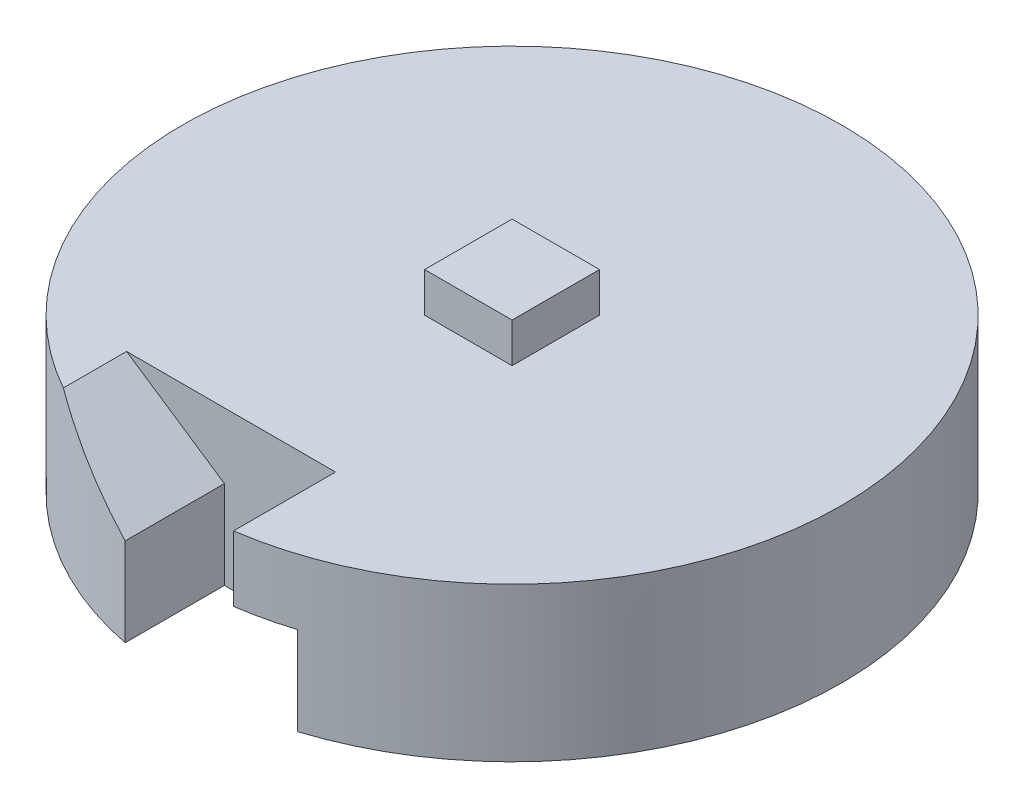
ISO-10303-21;
HEADER;
FILE_DESCRIPTION(('STEP AP214'),'2;1');
FILE_NAME('part.step','',(''),(''),'','','');
FILE_SCHEMA(('AUTOMOTIVE_DESIGN { 1 0 10303 214 1 1 1 1 }'));
ENDSEC;
DATA;
#1=APPLICATION_CONTEXT('core data for automotive mechanical design processes');
#2=APPLICATION_PROTOCOL_DEFINITION('international standard','automotive_design',2000,#1);
#3=PRODUCT_CONTEXT('',#1,'mechanical');
#4=PRODUCT('Part','Part','',(#3));
#5=PRODUCT_RELATED_PRODUCT_CATEGORY('part','',(#4));
#6=PRODUCT_DEFINITION_FORMATION('','',#4);
#7=PRODUCT_DEFINITION_CONTEXT('part definition',#1,'design');
#8=PRODUCT_DEFINITION('design','',#6,#7);
#9=PRODUCT_DEFINITION_SHAPE('','',#8);
#10=(LENGTH_UNIT() NAMED_UNIT(*) SI_UNIT(.MILLI.,.METRE.));
#11=(NAMED_UNIT(*) PLANE_ANGLE_UNIT() SI_UNIT($,.RADIAN.));
#12=(NAMED_UNIT(*) SI_UNIT($,.STERADIAN.) SOLID_ANGLE_UNIT());
#13=UNCERTAINTY_MEASURE_WITH_UNIT(LENGTH_MEASURE(1.E-05),#10,'distance_accuracy_value','');
#14=(GEOMETRIC_REPRESENTATION_CONTEXT(3) GLOBAL_UNCERTAINTY_ASSIGNED_CONTEXT((#13)) GLOBAL_UNIT_ASSIGNED_CONTEXT((#10,
#11,#12)) REPRESENTATION_CONTEXT('',''));
#15=CARTESIAN_POINT('',(0.,0.,0.));
#16=DIRECTION('',(0.,0.,1.));
#17=DIRECTION('',(1.,0.,0.));
#18=AXIS2_PLACEMENT_3D('',#15,#16,#17);
#19=CARTESIAN_POINT('',(0.,17.5,0.));
#20=DIRECTION('',(0.,1.,0.));
#21=DIRECTION('',(0.,0.,1.));
#22=AXIS2_PLACEMENT_3D('',#19,#20,#21);
#23=PLANE('',#22);
#24=DIRECTION('',(0.,0.,-1.));
#25=VECTOR('',#24,1.);
#26=CARTESIAN_POINT('',(5.40916797594821,17.5,0.));
#27=LINE('',#26,#25);
#28=CARTESIAN_POINT('',(5.40916797594821,17.5,37.1078280394848));
#29=VERTEX_POINT('',#28);
#30=CARTESIAN_POINT('',(5.40916797594821,17.5,25.5));
#31=VERTEX_POINT('',#30);
#32=EDGE_CURVE('E47',#29,#31,#27,.T.);
#33=ORIENTED_EDGE('',*,*,#32,.F.);
#34=CARTESIAN_POINT('',(0.,17.5,0.));
#35=DIRECTION('',(0.,1.,0.));
#36=DIRECTION('',(0.,0.,1.));
#37=AXIS2_PLACEMENT_3D('',#34,#35,#36);
#38=CIRCLE('',#37,37.5);
#39=CARTESIAN_POINT('',(-18.3618136354973,17.5,32.6969998626061));
#40=VERTEX_POINT('',#39);
#41=EDGE_CURVE('E196',#29,#40,#38,.T.);
#42=ORIENTED_EDGE('',*,*,#41,.T.);
#43=DIRECTION('',(0.,0.,1.));
#44=VECTOR('',#43,1.);
#45=CARTESIAN_POINT('',(-18.3618136354973,17.5,0.));
#46=LINE('',#45,#44);
#47=CARTESIAN_POINT('',(-18.3618136354973,17.5,25.5));
#48=VERTEX_POINT('',#47);
#49=EDGE_CURVE('E209',#48,#40,#46,.T.);
#50=ORIENTED_EDGE('',*,*,#49,.F.);
#51=DIRECTION('',(1.,0.,0.));
#52=VECTOR('',#51,1.);
#53=CARTESIAN_POINT('',(0.,17.5,25.5));
#54=LINE('',#53,#52);
#55=EDGE_CURVE('E175',#48,#31,#54,.T.);
#56=ORIENTED_EDGE('',*,*,#55,.T.);
#57=EDGE_LOOP('',(#33,#42,#50,#56));
#58=FACE_BOUND('',#57,.T.);
#59=DIRECTION('',(1.,0.,0.));
#60=VECTOR('',#59,1.);
#61=CARTESIAN_POINT('',(0.,17.5,-4.975));
#62=LINE('',#61,#60);
#63=CARTESIAN_POINT('',(-4.975,17.5,-4.975));
#64=VERTEX_POINT('',#63);
#65=CARTESIAN_POINT('',(4.975,17.5,-4.975));
#66=VERTEX_POINT('',#65);
#67=EDGE_CURVE('E157',#64,#66,#62,.T.);
#68=ORIENTED_EDGE('',*,*,#67,.T.);
#69=DIRECTION('',(0.,0.,1.));
#70=VECTOR('',#69,1.);
#71=CARTESIAN_POINT('',(4.975,17.5,0.));
#72=LINE('',#71,#70);
#73=CARTESIAN_POINT('',(4.975,17.5,4.975));
#74=VERTEX_POINT('',#73);
#75=EDGE_CURVE('E146',#66,#74,#72,.T.);
#76=ORIENTED_EDGE('',*,*,#75,.T.);
#77=DIRECTION('',(-1.,0.,0.));
#78=VECTOR('',#77,1.);
#79=CARTESIAN_POINT('',(0.,17.5,4.975));
#80=LINE('',#79,#78);
#81=CARTESIAN_POINT('',(-4.975,17.5,4.975));
#82=VERTEX_POINT('',#81);
#83=EDGE_CURVE('E147',#74,#82,#80,.T.);
#84=ORIENTED_EDGE('',*,*,#83,.T.);
#85=DIRECTION('',(0.,0.,-1.));
#86=VECTOR('',#85,1.);
#87=CARTESIAN_POINT('',(-4.975,17.5,0.));
#88=LINE('',#87,#86);
#89=EDGE_CURVE('E150',#82,#64,#88,.T.);
#90=ORIENTED_EDGE('',*,*,#89,.T.);
#91=EDGE_LOOP('',(#68,#76,#84,#90));
#92=FACE_BOUND('',#91,.T.);
#93=ADVANCED_FACE('F39',(#58,#92),#23,.T.);
#94=CARTESIAN_POINT('',(0.,17.5,0.));
#95=DIRECTION('',(0.,-1.,0.));
#96=DIRECTION('',(0.,0.,-1.));
#97=AXIS2_PLACEMENT_3D('',#94,#95,#96);
#98=CYLINDRICAL_SURFACE('',#97,37.5);
#99=ORIENTED_EDGE('',*,*,#41,.F.);
#100=DIRECTION('',(0.,-1.,0.));
#101=VECTOR('',#100,1.);
#102=CARTESIAN_POINT('',(5.40916797594821,17.5,37.1078280394848));
#103=LINE('',#102,#101);
#104=CARTESIAN_POINT('',(5.40916797594821,10.0586939101936,37.1078280394848));
#105=VERTEX_POINT('',#104);
#106=EDGE_CURVE('E192',#29,#105,#103,.T.);
#107=ORIENTED_EDGE('',*,*,#106,.T.);
#108=CARTESIAN_POINT('',(0.,10.0586939101936,0.));
#109=DIRECTION('',(0.,1.,0.));
#110=DIRECTION('',(0.,0.,1.));
#111=AXIS2_PLACEMENT_3D('',#108,#109,#110);
#112=CIRCLE('',#111,37.5);
#113=CARTESIAN_POINT('',(11.3377548552186,10.0586939101936,35.7450040543146));
#114=VERTEX_POINT('',#113);
#115=EDGE_CURVE('E11',#105,#114,#112,.T.);
#116=ORIENTED_EDGE('',*,*,#115,.T.);
#117=DIRECTION('',(0.,-1.,0.));
#118=VECTOR('',#117,1.);
#119=CARTESIAN_POINT('',(11.3377548552186,17.5,35.7450040543146));
#120=LINE('',#119,#118);
#121=CARTESIAN_POINT('',(11.3377548552186,0.,35.7450040543146));
#122=VERTEX_POINT('',#121);
#123=EDGE_CURVE('E186',#114,#122,#120,.T.);
#124=ORIENTED_EDGE('',*,*,#123,.T.);
#125=CARTESIAN_POINT('',(0.,0.,0.));
#126=DIRECTION('',(0.,1.,0.));
#127=DIRECTION('',(0.,0.,1.));
#128=AXIS2_PLACEMENT_3D('',#125,#126,#127);
#129=CIRCLE('',#128,37.5);
#130=CARTESIAN_POINT('',(-7.23202995206033,0.,36.7960288994954));
#131=VERTEX_POINT('',#130);
#132=EDGE_CURVE('E195',#122,#131,#129,.T.);
#133=ORIENTED_EDGE('',*,*,#132,.T.);
#134=DIRECTION('',(0.,-1.,0.));
#135=VECTOR('',#134,1.);
#136=CARTESIAN_POINT('',(-7.23202995206033,17.5,36.7960288994954));
#137=LINE('',#136,#135);
#138=CARTESIAN_POINT('',(-7.23202995206033,10.0401319165543,36.7960288994954));
#139=VERTEX_POINT('',#138);
#140=EDGE_CURVE('E183',#131,#139,#137,.F.);
#141=ORIENTED_EDGE('',*,*,#140,.T.);
#142=CARTESIAN_POINT('',(0.,5.19277899825944,0.));
#143=DIRECTION('',(-0.556765929579434,-0.830669428629433,0.));
#144=DIRECTION('',(0.830669428629433,-0.556765929579434,0.));
#145=AXIS2_PLACEMENT_3D('',#142,#143,#144);
#146=ELLIPSE('',#145,45.1443121746677,37.5);
#147=EDGE_CURVE('E189',#139,#40,#146,.T.);
#148=ORIENTED_EDGE('',*,*,#147,.T.);
#149=EDGE_LOOP('',(#99,#107,#116,#124,#133,#141,#148));
#150=FACE_BOUND('',#149,.T.);
#151=ADVANCED_FACE('F41',(#150),#98,.T.);
#152=CARTESIAN_POINT('',(0.,0.,0.));
#153=DIRECTION('',(0.,1.,0.));
#154=DIRECTION('',(0.,0.,1.));
#155=AXIS2_PLACEMENT_3D('',#152,#153,#154);
#156=PLANE('',#155);
#157=CARTESIAN_POINT('',(0.,0.,0.));
#158=DIRECTION('',(0.,-1.,0.));
#159=DIRECTION('',(0.,0.,-1.));
#160=AXIS2_PLACEMENT_3D('',#157,#158,#159);
#161=CIRCLE('',#160,5.);
#162=CARTESIAN_POINT('',(0.,0.,-5.));
#163=VERTEX_POINT('',#162);
#164=EDGE_CURVE('E345',#163,#163,#161,.T.);
#165=ORIENTED_EDGE('',*,*,#164,.F.);
#166=EDGE_LOOP('',(#165));
#167=FACE_BOUND('',#166,.T.);
#168=ORIENTED_EDGE('',*,*,#132,.F.);
#169=DIRECTION('',(0.,0.,-1.));
#170=VECTOR('',#169,1.);
#171=CARTESIAN_POINT('',(11.3377548552186,0.,0.));
#172=LINE('',#171,#170);
#173=CARTESIAN_POINT('',(11.3377548552186,0.,25.5));
#174=VERTEX_POINT('',#173);
#175=EDGE_CURVE('E206',#122,#174,#172,.T.);
#176=ORIENTED_EDGE('',*,*,#175,.T.);
#177=DIRECTION('',(1.,0.,0.));
#178=VECTOR('',#177,1.);
#179=CARTESIAN_POINT('',(0.,0.,25.5));
#180=LINE('',#179,#178);
#181=CARTESIAN_POINT('',(-7.23202995206033,0.,25.5));
#182=VERTEX_POINT('',#181);
#183=EDGE_CURVE('E199',#182,#174,#180,.T.);
#184=ORIENTED_EDGE('',*,*,#183,.F.);
#185=DIRECTION('',(0.,0.,1.));
#186=VECTOR('',#185,1.);
#187=CARTESIAN_POINT('',(-7.23202995206033,0.,0.));
#188=LINE('',#187,#186);
#189=EDGE_CURVE('E203',#182,#131,#188,.T.);
#190=ORIENTED_EDGE('',*,*,#189,.T.);
#191=EDGE_LOOP('',(#168,#176,#184,#190));
#192=FACE_BOUND('',#191,.T.);
#193=ADVANCED_FACE('F230',(#167,#192),#156,.F.);
#194=CARTESIAN_POINT('',(5.40916797594821,10.0586939101936,25.5));
#195=DIRECTION('',(0.,1.,0.));
#196=DIRECTION('',(0.,0.,1.));
#197=AXIS2_PLACEMENT_3D('',#194,#195,#196);
#198=PLANE('',#197);
#199=DIRECTION('',(0.,0.,1.));
#200=VECTOR('',#199,1.);
#201=CARTESIAN_POINT('',(5.40916797594821,10.0586939101936,25.5));
#202=LINE('',#201,#200);
#203=CARTESIAN_POINT('',(5.40916797594821,10.0586939101936,25.5));
#204=VERTEX_POINT('',#203);
#205=EDGE_CURVE('E172',#204,#105,#202,.T.);
#206=ORIENTED_EDGE('',*,*,#205,.F.);
#207=DIRECTION('',(-1.,0.,0.));
#208=VECTOR('',#207,1.);
#209=CARTESIAN_POINT('',(5.40916797594821,10.0586939101936,25.5));
#210=LINE('',#209,#208);
#211=CARTESIAN_POINT('',(11.3377548552186,10.0586939101936,25.5));
#212=VERTEX_POINT('',#211);
#213=EDGE_CURVE('E168',#212,#204,#210,.T.);
#214=ORIENTED_EDGE('',*,*,#213,.F.);
#215=DIRECTION('',(0.,0.,1.));
#216=VECTOR('',#215,1.);
#217=CARTESIAN_POINT('',(11.3377548552186,10.0586939101936,25.5));
#218=LINE('',#217,#216);
#219=EDGE_CURVE('E176',#212,#114,#218,.T.);
#220=ORIENTED_EDGE('',*,*,#219,.T.);
#221=ORIENTED_EDGE('',*,*,#115,.F.);
#222=EDGE_LOOP('',(#206,#214,#220,#221));
#223=FACE_BOUND('',#222,.T.);
#224=ADVANCED_FACE('F236',(#223),#198,.F.);
#225=CARTESIAN_POINT('',(5.40916797594821,17.669921882635,25.5));
#226=DIRECTION('',(1.,0.,0.));
#227=DIRECTION('',(0.,1.,0.));
#228=AXIS2_PLACEMENT_3D('',#225,#226,#227);
#229=PLANE('',#228);
#230=ORIENTED_EDGE('',*,*,#32,.T.);
#231=DIRECTION('',(0.,1.,0.));
#232=VECTOR('',#231,1.);
#233=CARTESIAN_POINT('',(5.40916797594821,17.669921882635,25.5));
#234=LINE('',#233,#232);
#235=EDGE_CURVE('E160',#204,#31,#234,.T.);
#236=ORIENTED_EDGE('',*,*,#235,.F.);
#237=ORIENTED_EDGE('',*,*,#205,.T.);
#238=ORIENTED_EDGE('',*,*,#106,.F.);
#239=EDGE_LOOP('',(#230,#236,#237,#238));
#240=FACE_BOUND('',#239,.T.);
#241=ADVANCED_FACE('F213',(#240),#229,.F.);
#242=CARTESIAN_POINT('',(-18.6153293512788,17.669921882635,25.5));
#243=DIRECTION('',(-0.556765929579434,-0.830669428629433,0.));
#244=DIRECTION('',(0.830669428629433,-0.556765929579434,0.));
#245=AXIS2_PLACEMENT_3D('',#242,#243,#244);
#246=PLANE('',#245);
#247=DIRECTION('',(0.,0.,1.));
#248=VECTOR('',#247,1.);
#249=CARTESIAN_POINT('',(-7.23202995206033,10.0401319165543,25.5));
#250=LINE('',#249,#248);
#251=CARTESIAN_POINT('',(-7.23202995206033,10.0401319165543,25.5));
#252=VERTEX_POINT('',#251);
#253=EDGE_CURVE('E171',#252,#139,#250,.T.);
#254=ORIENTED_EDGE('',*,*,#253,.F.);
#255=DIRECTION('',(0.830669428629433,-0.556765929579434,0.));
#256=VECTOR('',#255,1.);
#257=CARTESIAN_POINT('',(-18.6153293512788,17.669921882635,25.5));
#258=LINE('',#257,#256);
#259=EDGE_CURVE('E163',#48,#252,#258,.T.);
#260=ORIENTED_EDGE('',*,*,#259,.F.);
#261=ORIENTED_EDGE('',*,*,#49,.T.);
#262=ORIENTED_EDGE('',*,*,#147,.F.);
#263=EDGE_LOOP('',(#254,#260,#261,#262));
#264=FACE_BOUND('',#263,.T.);
#265=ADVANCED_FACE('F223',(#264),#246,.F.);
#266=CARTESIAN_POINT('',(11.3377548552186,10.0586939101936,25.5));
#267=DIRECTION('',(1.,0.,0.));
#268=DIRECTION('',(0.,1.,0.));
#269=AXIS2_PLACEMENT_3D('',#266,#267,#268);
#270=PLANE('',#269);
#271=ORIENTED_EDGE('',*,*,#219,.F.);
#272=DIRECTION('',(0.,1.,0.));
#273=VECTOR('',#272,1.);
#274=CARTESIAN_POINT('',(11.3377548552186,10.0586939101936,25.5));
#275=LINE('',#274,#273);
#276=EDGE_CURVE('E166',#174,#212,#275,.T.);
#277=ORIENTED_EDGE('',*,*,#276,.F.);
#278=ORIENTED_EDGE('',*,*,#175,.F.);
#279=ORIENTED_EDGE('',*,*,#123,.F.);
#280=EDGE_LOOP('',(#271,#277,#278,#279));
#281=FACE_BOUND('',#280,.T.);
#282=ADVANCED_FACE('F234',(#281),#270,.F.);
#283=CARTESIAN_POINT('',(-7.23202995206033,10.0401319165543,25.5));
#284=DIRECTION('',(-1.,0.,0.));
#285=DIRECTION('',(0.,0.,1.));
#286=AXIS2_PLACEMENT_3D('',#283,#284,#285);
#287=PLANE('',#286);
#288=ORIENTED_EDGE('',*,*,#189,.F.);
#289=DIRECTION('',(0.,-1.,0.));
#290=VECTOR('',#289,1.);
#291=CARTESIAN_POINT('',(-7.23202995206033,10.0401319165543,25.5));
#292=LINE('',#291,#290);
#293=EDGE_CURVE('E62',#252,#182,#292,.T.);
#294=ORIENTED_EDGE('',*,*,#293,.F.);
#295=ORIENTED_EDGE('',*,*,#253,.T.);
#296=ORIENTED_EDGE('',*,*,#140,.F.);
#297=EDGE_LOOP('',(#288,#294,#295,#296));
#298=FACE_BOUND('',#297,.T.);
#299=ADVANCED_FACE('F227',(#298),#287,.F.);
#300=CARTESIAN_POINT('',(0.,0.,25.5));
#301=DIRECTION('',(0.,0.,1.));
#302=DIRECTION('',(1.,0.,0.));
#303=AXIS2_PLACEMENT_3D('',#300,#301,#302);
#304=PLANE('',#303);
#305=ORIENTED_EDGE('',*,*,#259,.T.);
#306=ORIENTED_EDGE('',*,*,#293,.T.);
#307=ORIENTED_EDGE('',*,*,#183,.T.);
#308=ORIENTED_EDGE('',*,*,#276,.T.);
#309=ORIENTED_EDGE('',*,*,#213,.T.);
#310=ORIENTED_EDGE('',*,*,#235,.T.);
#311=ORIENTED_EDGE('',*,*,#55,.F.);
#312=EDGE_LOOP('',(#305,#306,#307,#308,#309,#310,#311));
#313=FACE_BOUND('',#312,.T.);
#314=ADVANCED_FACE('F216',(#313),#304,.T.);
#315=CARTESIAN_POINT('',(4.975,22.,-4.975));
#316=DIRECTION('',(-1.,0.,0.));
#317=DIRECTION('',(0.,0.,1.));
#318=AXIS2_PLACEMENT_3D('',#315,#316,#317);
#319=PLANE('',#318);
#320=ORIENTED_EDGE('',*,*,#75,.F.);
#321=DIRECTION('',(0.,-1.,0.));
#322=VECTOR('',#321,1.);
#323=CARTESIAN_POINT('',(4.975,22.,-4.975));
#324=LINE('',#323,#322);
#325=CARTESIAN_POINT('',(4.975,22.,-4.975));
#326=VERTEX_POINT('',#325);
#327=EDGE_CURVE('E127',#326,#66,#324,.T.);
#328=ORIENTED_EDGE('',*,*,#327,.F.);
#329=DIRECTION('',(0.,0.,-1.));
#330=VECTOR('',#329,1.);
#331=CARTESIAN_POINT('',(4.975,22.,-4.975));
#332=LINE('',#331,#330);
#333=CARTESIAN_POINT('',(4.975,22.,4.975));
#334=VERTEX_POINT('',#333);
#335=EDGE_CURVE('E134',#334,#326,#332,.T.);
#336=ORIENTED_EDGE('',*,*,#335,.F.);
#337=DIRECTION('',(0.,-1.,0.));
#338=VECTOR('',#337,1.);
#339=CARTESIAN_POINT('',(4.975,22.,4.975));
#340=LINE('',#339,#338);
#341=EDGE_CURVE('E352',#334,#74,#340,.T.);
#342=ORIENTED_EDGE('',*,*,#341,.T.);
#343=EDGE_LOOP('',(#320,#328,#336,#342));
#344=FACE_BOUND('',#343,.T.);
#345=ADVANCED_FACE('F144',(#344),#319,.F.);
#346=CARTESIAN_POINT('',(-4.975,22.,-4.975));
#347=DIRECTION('',(0.,0.,1.));
#348=DIRECTION('',(1.,0.,0.));
#349=AXIS2_PLACEMENT_3D('',#346,#347,#348);
#350=PLANE('',#349);
#351=ORIENTED_EDGE('',*,*,#67,.F.);
#352=DIRECTION('',(0.,-1.,0.));
#353=VECTOR('',#352,1.);
#354=CARTESIAN_POINT('',(-4.975,22.,-4.975));
#355=LINE('',#354,#353);
#356=CARTESIAN_POINT('',(-4.975,22.,-4.975));
#357=VERTEX_POINT('',#356);
#358=EDGE_CURVE('E130',#357,#64,#355,.T.);
#359=ORIENTED_EDGE('',*,*,#358,.F.);
#360=DIRECTION('',(-1.,0.,0.));
#361=VECTOR('',#360,1.);
#362=CARTESIAN_POINT('',(-4.975,22.,-4.975));
#363=LINE('',#362,#361);
#364=EDGE_CURVE('E123',#326,#357,#363,.T.);
#365=ORIENTED_EDGE('',*,*,#364,.F.);
#366=ORIENTED_EDGE('',*,*,#327,.T.);
#367=EDGE_LOOP('',(#351,#359,#365,#366));
#368=FACE_BOUND('',#367,.T.);
#369=ADVANCED_FACE('F125',(#368),#350,.F.);
#370=CARTESIAN_POINT('',(-4.975,22.,-4.975));
#371=DIRECTION('',(1.,0.,0.));
#372=DIRECTION('',(0.,0.,-1.));
#373=AXIS2_PLACEMENT_3D('',#370,#371,#372);
#374=PLANE('',#373);
#375=ORIENTED_EDGE('',*,*,#89,.F.);
#376=DIRECTION('',(0.,-1.,0.));
#377=VECTOR('',#376,1.);
#378=CARTESIAN_POINT('',(-4.975,22.,4.975));
#379=LINE('',#378,#377);
#380=CARTESIAN_POINT('',(-4.975,22.,4.975));
#381=VERTEX_POINT('',#380);
#382=EDGE_CURVE('E54',#381,#82,#379,.T.);
#383=ORIENTED_EDGE('',*,*,#382,.F.);
#384=DIRECTION('',(0.,0.,1.));
#385=VECTOR('',#384,1.);
#386=CARTESIAN_POINT('',(-4.975,22.,-4.975));
#387=LINE('',#386,#385);
#388=EDGE_CURVE('E133',#357,#381,#387,.T.);
#389=ORIENTED_EDGE('',*,*,#388,.F.);
#390=ORIENTED_EDGE('',*,*,#358,.T.);
#391=EDGE_LOOP('',(#375,#383,#389,#390));
#392=FACE_BOUND('',#391,.T.);
#393=ADVANCED_FACE('F294',(#392),#374,.F.);
#394=CARTESIAN_POINT('',(-4.975,22.,4.975));
#395=DIRECTION('',(0.,0.,-1.));
#396=DIRECTION('',(-1.,0.,0.));
#397=AXIS2_PLACEMENT_3D('',#394,#395,#396);
#398=PLANE('',#397);
#399=ORIENTED_EDGE('',*,*,#83,.F.);
#400=ORIENTED_EDGE('',*,*,#341,.F.);
#401=DIRECTION('',(1.,0.,0.));
#402=VECTOR('',#401,1.);
#403=CARTESIAN_POINT('',(-4.975,22.,4.975));
#404=LINE('',#403,#402);
#405=EDGE_CURVE('E138',#381,#334,#404,.T.);
#406=ORIENTED_EDGE('',*,*,#405,.F.);
#407=ORIENTED_EDGE('',*,*,#382,.T.);
#408=EDGE_LOOP('',(#399,#400,#406,#407));
#409=FACE_BOUND('',#408,.T.);
#410=ADVANCED_FACE('F303',(#409),#398,.F.);
#411=CARTESIAN_POINT('',(0.,22.,0.));
#412=DIRECTION('',(0.,1.,0.));
#413=DIRECTION('',(0.,0.,1.));
#414=AXIS2_PLACEMENT_3D('',#411,#412,#413);
#415=PLANE('',#414);
#416=ORIENTED_EDGE('',*,*,#335,.T.);
#417=ORIENTED_EDGE('',*,*,#364,.T.);
#418=ORIENTED_EDGE('',*,*,#388,.T.);
#419=ORIENTED_EDGE('',*,*,#405,.T.);
#420=EDGE_LOOP('',(#416,#417,#418,#419));
#421=FACE_BOUND('',#420,.T.);
#422=ADVANCED_FACE('F137',(#421),#415,.T.);
#423=CARTESIAN_POINT('',(0.,8.,0.));
#424=DIRECTION('',(0.,-1.,0.));
#425=DIRECTION('',(0.,0.,-1.));
#426=AXIS2_PLACEMENT_3D('',#423,#424,#425);
#427=CYLINDRICAL_SURFACE('',#426,5.);
#428=CARTESIAN_POINT('',(0.,8.,0.));
#429=DIRECTION('',(0.,-1.,0.));
#430=DIRECTION('',(0.,0.,-1.));
#431=AXIS2_PLACEMENT_3D('',#428,#429,#430);
#432=CIRCLE('',#431,5.);
#433=CARTESIAN_POINT('',(0.,8.,-5.));
#434=VERTEX_POINT('',#433);
#435=EDGE_CURVE('E142',#434,#434,#432,.T.);
#436=ORIENTED_EDGE('',*,*,#435,.F.);
#437=EDGE_LOOP('',(#436));
#438=FACE_BOUND('',#437,.T.);
#439=ORIENTED_EDGE('',*,*,#164,.T.);
#440=EDGE_LOOP('',(#439));
#441=FACE_BOUND('',#440,.T.);
#442=ADVANCED_FACE('F321',(#438,#441),#427,.F.);
#443=CARTESIAN_POINT('',(0.,8.,0.));
#444=DIRECTION('',(0.,-1.,0.));
#445=DIRECTION('',(0.,0.,-1.));
#446=AXIS2_PLACEMENT_3D('',#443,#444,#445);
#447=PLANE('',#446);
#448=ORIENTED_EDGE('',*,*,#435,.T.);
#449=EDGE_LOOP('',(#448));
#450=FACE_BOUND('',#449,.T.);
#451=ADVANCED_FACE('F330',(#450),#447,.T.);
#452=CLOSED_SHELL('',(#93,#151,#193,#224,#241,#265,#282,#299,#314,#345,#369,#393,#410,#422,#442,#451));
#453=MANIFOLD_SOLID_BREP('B2',#452);
#454=ADVANCED_BREP_SHAPE_REPRESENTATION('',(#18,#453),#14);
#455=SHAPE_DEFINITION_REPRESENTATION(#9,#454);
ENDSEC;
END-ISO-10303-21;
